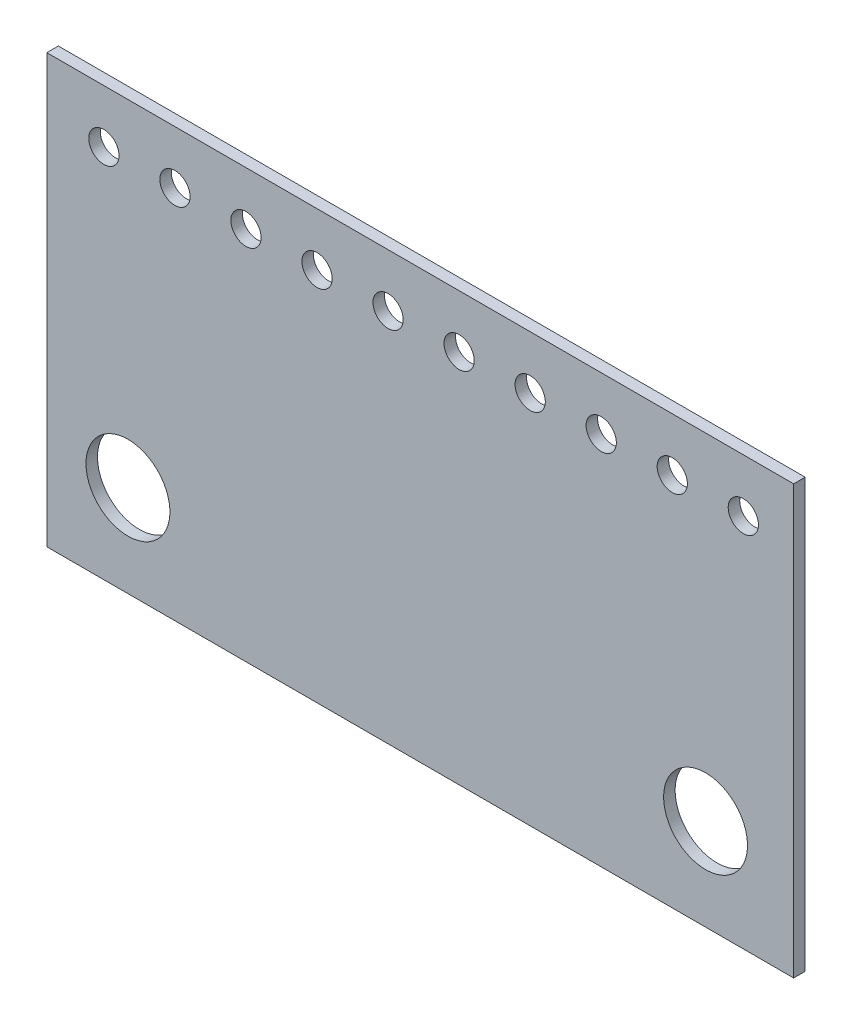
ISO-10303-21;
HEADER;
FILE_DESCRIPTION(('STEP AP214'),'2;1');
FILE_NAME('part.step','',(''),(''),'','','');
FILE_SCHEMA(('AUTOMOTIVE_DESIGN { 1 0 10303 214 1 1 1 1 }'));
ENDSEC;
DATA;
#1=APPLICATION_CONTEXT('core data for automotive mechanical design processes');
#2=APPLICATION_PROTOCOL_DEFINITION('international standard','automotive_design',2000,#1);
#3=PRODUCT_CONTEXT('',#1,'mechanical');
#4=PRODUCT('Part','Part','',(#3));
#5=PRODUCT_RELATED_PRODUCT_CATEGORY('part','',(#4));
#6=PRODUCT_DEFINITION_FORMATION('','',#4);
#7=PRODUCT_DEFINITION_CONTEXT('part definition',#1,'design');
#8=PRODUCT_DEFINITION('design','',#6,#7);
#9=PRODUCT_DEFINITION_SHAPE('','',#8);
#10=(LENGTH_UNIT() NAMED_UNIT(*) SI_UNIT(.MILLI.,.METRE.));
#11=(NAMED_UNIT(*) PLANE_ANGLE_UNIT() SI_UNIT($,.RADIAN.));
#12=(NAMED_UNIT(*) SI_UNIT($,.STERADIAN.) SOLID_ANGLE_UNIT());
#13=UNCERTAINTY_MEASURE_WITH_UNIT(LENGTH_MEASURE(1.E-05),#10,'distance_accuracy_value','');
#14=(GEOMETRIC_REPRESENTATION_CONTEXT(3) GLOBAL_UNCERTAINTY_ASSIGNED_CONTEXT((#13)) GLOBAL_UNIT_ASSIGNED_CONTEXT((#10,
#11,#12)) REPRESENTATION_CONTEXT('',''));
#15=CARTESIAN_POINT('',(0.,0.,0.));
#16=DIRECTION('',(0.,0.,1.));
#17=DIRECTION('',(1.,0.,0.));
#18=AXIS2_PLACEMENT_3D('',#15,#16,#17);
#19=CARTESIAN_POINT('',(0.,0.,0.41148));
#20=DIRECTION('',(0.,0.,1.));
#21=DIRECTION('',(1.,0.,0.));
#22=AXIS2_PLACEMENT_3D('',#19,#20,#21);
#23=PLANE('',#22);
#24=CARTESIAN_POINT('',(42.68003,38.80002,0.411480000000006));
#25=DIRECTION('',(0.,0.,-1.));
#26=DIRECTION('',(-1.,0.,0.));
#27=AXIS2_PLACEMENT_3D('',#24,#25,#26);
#28=CIRCLE('',#27,0.540499999999985);
#29=CARTESIAN_POINT('',(42.13953,38.80002,0.411480000000006));
#30=VERTEX_POINT('',#29);
#31=EDGE_CURVE('E144',#30,#30,#28,.T.);
#32=ORIENTED_EDGE('',*,*,#31,.T.);
#33=EDGE_LOOP('',(#32));
#34=FACE_BOUND('',#33,.T.);
#35=CARTESIAN_POINT('',(45.22003,38.80002,0.411480000000006));
#36=DIRECTION('',(0.,0.,-1.));
#37=DIRECTION('',(-1.,0.,0.));
#38=AXIS2_PLACEMENT_3D('',#35,#36,#37);
#39=CIRCLE('',#38,0.540499999999985);
#40=CARTESIAN_POINT('',(44.67953,38.80002,0.411480000000006));
#41=VERTEX_POINT('',#40);
#42=EDGE_CURVE('E138',#41,#41,#39,.T.);
#43=ORIENTED_EDGE('',*,*,#42,.T.);
#44=EDGE_LOOP('',(#43));
#45=FACE_BOUND('',#44,.T.);
#46=CARTESIAN_POINT('',(50.30003,38.80002,0.411480000000006));
#47=DIRECTION('',(0.,0.,-1.));
#48=DIRECTION('',(-1.,0.,0.));
#49=AXIS2_PLACEMENT_3D('',#46,#47,#48);
#50=CIRCLE('',#49,0.540499999999985);
#51=CARTESIAN_POINT('',(49.75953,38.80002,0.411480000000006));
#52=VERTEX_POINT('',#51);
#53=EDGE_CURVE('E135',#52,#52,#50,.T.);
#54=ORIENTED_EDGE('',*,*,#53,.T.);
#55=EDGE_LOOP('',(#54));
#56=FACE_BOUND('',#55,.T.);
#57=CARTESIAN_POINT('',(47.76003,38.80002,0.411480000000006));
#58=DIRECTION('',(0.,0.,-1.));
#59=DIRECTION('',(-1.,0.,0.));
#60=AXIS2_PLACEMENT_3D('',#57,#58,#59);
#61=CIRCLE('',#60,0.540499999999985);
#62=CARTESIAN_POINT('',(47.21953,38.80002,0.411480000000006));
#63=VERTEX_POINT('',#62);
#64=EDGE_CURVE('E130',#63,#63,#61,.T.);
#65=ORIENTED_EDGE('',*,*,#64,.T.);
#66=EDGE_LOOP('',(#65));
#67=FACE_BOUND('',#66,.T.);
#68=CARTESIAN_POINT('',(37.60003,38.80002,0.411480000000006));
#69=DIRECTION('',(0.,0.,-1.));
#70=DIRECTION('',(-1.,0.,0.));
#71=AXIS2_PLACEMENT_3D('',#68,#69,#70);
#72=CIRCLE('',#71,0.540499999999985);
#73=CARTESIAN_POINT('',(37.05953,38.80002,0.411480000000006));
#74=VERTEX_POINT('',#73);
#75=EDGE_CURVE('E109',#74,#74,#72,.T.);
#76=ORIENTED_EDGE('',*,*,#75,.T.);
#77=EDGE_LOOP('',(#76));
#78=FACE_BOUND('',#77,.T.);
#79=DIRECTION('',(0.,-1.,0.));
#80=VECTOR('',#79,1.);
#81=CARTESIAN_POINT('',(25.4,40.7,0.41148));
#82=LINE('',#81,#80);
#83=CARTESIAN_POINT('',(25.4,40.7,0.41148));
#84=VERTEX_POINT('',#83);
#85=CARTESIAN_POINT('',(25.4,25.4,0.41148));
#86=VERTEX_POINT('',#85);
#87=EDGE_CURVE('E92',#84,#86,#82,.T.);
#88=ORIENTED_EDGE('',*,*,#87,.T.);
#89=DIRECTION('',(1.,0.,0.));
#90=VECTOR('',#89,1.);
#91=CARTESIAN_POINT('',(25.4,25.4,0.41148));
#92=LINE('',#91,#90);
#93=CARTESIAN_POINT('',(52.1,25.4,0.41148));
#94=VERTEX_POINT('',#93);
#95=EDGE_CURVE('E89',#86,#94,#92,.T.);
#96=ORIENTED_EDGE('',*,*,#95,.T.);
#97=DIRECTION('',(0.,1.,0.));
#98=VECTOR('',#97,1.);
#99=CARTESIAN_POINT('',(52.1,25.4,0.41148));
#100=LINE('',#99,#98);
#101=CARTESIAN_POINT('',(52.1,40.7,0.41148));
#102=VERTEX_POINT('',#101);
#103=EDGE_CURVE('E91',#94,#102,#100,.T.);
#104=ORIENTED_EDGE('',*,*,#103,.T.);
#105=DIRECTION('',(-1.,0.,0.));
#106=VECTOR('',#105,1.);
#107=CARTESIAN_POINT('',(52.1,40.7,0.41148));
#108=LINE('',#107,#106);
#109=EDGE_CURVE('E58',#102,#84,#108,.T.);
#110=ORIENTED_EDGE('',*,*,#109,.T.);
#111=EDGE_LOOP('',(#88,#96,#104,#110));
#112=FACE_BOUND('',#111,.T.);
#113=CARTESIAN_POINT('',(40.14003,38.80002,0.411480000000006));
#114=DIRECTION('',(0.,0.,-1.));
#115=DIRECTION('',(-1.,0.,0.));
#116=AXIS2_PLACEMENT_3D('',#113,#114,#115);
#117=CIRCLE('',#116,0.540499999999985);
#118=CARTESIAN_POINT('',(39.59953,38.80002,0.411480000000006));
#119=VERTEX_POINT('',#118);
#120=EDGE_CURVE('E151',#119,#119,#117,.T.);
#121=ORIENTED_EDGE('',*,*,#120,.T.);
#122=EDGE_LOOP('',(#121));
#123=FACE_BOUND('',#122,.T.);
#124=CARTESIAN_POINT('',(35.06003,38.80002,0.411480000000006));
#125=DIRECTION('',(0.,0.,-1.));
#126=DIRECTION('',(-1.,0.,0.));
#127=AXIS2_PLACEMENT_3D('',#124,#125,#126);
#128=CIRCLE('',#127,0.540499999999985);
#129=CARTESIAN_POINT('',(34.51953,38.80002,0.411480000000006));
#130=VERTEX_POINT('',#129);
#131=EDGE_CURVE('E160',#130,#130,#128,.T.);
#132=ORIENTED_EDGE('',*,*,#131,.T.);
#133=EDGE_LOOP('',(#132));
#134=FACE_BOUND('',#133,.T.);
#135=CARTESIAN_POINT('',(32.52003,38.80002,0.411480000000006));
#136=DIRECTION('',(0.,0.,-1.));
#137=DIRECTION('',(-1.,0.,0.));
#138=AXIS2_PLACEMENT_3D('',#135,#136,#137);
#139=CIRCLE('',#138,0.540499999999985);
#140=CARTESIAN_POINT('',(31.97953,38.80002,0.411480000000006));
#141=VERTEX_POINT('',#140);
#142=EDGE_CURVE('E162',#141,#141,#139,.T.);
#143=ORIENTED_EDGE('',*,*,#142,.T.);
#144=EDGE_LOOP('',(#143));
#145=FACE_BOUND('',#144,.T.);
#146=CARTESIAN_POINT('',(29.98003,38.80002,0.411480000000006));
#147=DIRECTION('',(0.,0.,-1.));
#148=DIRECTION('',(-1.,0.,0.));
#149=AXIS2_PLACEMENT_3D('',#146,#147,#148);
#150=CIRCLE('',#149,0.540499999999989);
#151=CARTESIAN_POINT('',(29.43953,38.80002,0.411480000000006));
#152=VERTEX_POINT('',#151);
#153=EDGE_CURVE('E166',#152,#152,#150,.T.);
#154=ORIENTED_EDGE('',*,*,#153,.T.);
#155=EDGE_LOOP('',(#154));
#156=FACE_BOUND('',#155,.T.);
#157=CARTESIAN_POINT('',(27.44003,38.80002,0.411480000000006));
#158=DIRECTION('',(0.,0.,-1.));
#159=DIRECTION('',(-1.,0.,0.));
#160=AXIS2_PLACEMENT_3D('',#157,#158,#159);
#161=CIRCLE('',#160,0.540499999999989);
#162=CARTESIAN_POINT('',(26.89953,38.80002,0.411480000000006));
#163=VERTEX_POINT('',#162);
#164=EDGE_CURVE('E172',#163,#163,#161,.T.);
#165=ORIENTED_EDGE('',*,*,#164,.T.);
#166=EDGE_LOOP('',(#165));
#167=FACE_BOUND('',#166,.T.);
#168=CARTESIAN_POINT('',(48.95002,28.68,0.411480000000006));
#169=DIRECTION('',(0.,0.,-1.));
#170=DIRECTION('',(-1.,0.,0.));
#171=AXIS2_PLACEMENT_3D('',#168,#169,#170);
#172=CIRCLE('',#171,1.49999999999999);
#173=CARTESIAN_POINT('',(47.45002,28.68,0.411480000000006));
#174=VERTEX_POINT('',#173);
#175=EDGE_CURVE('E182',#174,#174,#172,.T.);
#176=ORIENTED_EDGE('',*,*,#175,.T.);
#177=EDGE_LOOP('',(#176));
#178=FACE_BOUND('',#177,.T.);
#179=CARTESIAN_POINT('',(28.30002,28.68,0.411480000000006));
#180=DIRECTION('',(0.,0.,-1.));
#181=DIRECTION('',(-1.,0.,0.));
#182=AXIS2_PLACEMENT_3D('',#179,#180,#181);
#183=CIRCLE('',#182,1.49999999999999);
#184=CARTESIAN_POINT('',(26.80002,28.68,0.411480000000006));
#185=VERTEX_POINT('',#184);
#186=EDGE_CURVE('E186',#185,#185,#183,.T.);
#187=ORIENTED_EDGE('',*,*,#186,.T.);
#188=EDGE_LOOP('',(#187));
#189=FACE_BOUND('',#188,.T.);
#190=ADVANCED_FACE('F43',(#34,#45,#56,#67,#78,#112,#123,#134,#145,#156,#167,#178,#189),#23,.T.);
#191=CARTESIAN_POINT('',(0.,0.,0.));
#192=DIRECTION('',(0.,0.,1.));
#193=DIRECTION('',(1.,0.,0.));
#194=AXIS2_PLACEMENT_3D('',#191,#192,#193);
#195=PLANE('',#194);
#196=CARTESIAN_POINT('',(28.30002,28.68,0.));
#197=DIRECTION('',(0.,0.,-1.));
#198=DIRECTION('',(-1.,0.,0.));
#199=AXIS2_PLACEMENT_3D('',#196,#197,#198);
#200=CIRCLE('',#199,1.49999999999999);
#201=CARTESIAN_POINT('',(26.80002,28.68,0.));
#202=VERTEX_POINT('',#201);
#203=EDGE_CURVE('E187',#202,#202,#200,.T.);
#204=ORIENTED_EDGE('',*,*,#203,.F.);
#205=EDGE_LOOP('',(#204));
#206=FACE_BOUND('',#205,.T.);
#207=CARTESIAN_POINT('',(48.95002,28.68,0.));
#208=DIRECTION('',(0.,0.,-1.));
#209=DIRECTION('',(-1.,0.,0.));
#210=AXIS2_PLACEMENT_3D('',#207,#208,#209);
#211=CIRCLE('',#210,1.49999999999999);
#212=CARTESIAN_POINT('',(47.45002,28.68,0.));
#213=VERTEX_POINT('',#212);
#214=EDGE_CURVE('E184',#213,#213,#211,.T.);
#215=ORIENTED_EDGE('',*,*,#214,.F.);
#216=EDGE_LOOP('',(#215));
#217=FACE_BOUND('',#216,.T.);
#218=CARTESIAN_POINT('',(29.98003,38.80002,0.));
#219=DIRECTION('',(0.,0.,-1.));
#220=DIRECTION('',(-1.,0.,0.));
#221=AXIS2_PLACEMENT_3D('',#218,#219,#220);
#222=CIRCLE('',#221,0.540499999999989);
#223=CARTESIAN_POINT('',(29.43953,38.80002,0.));
#224=VERTEX_POINT('',#223);
#225=EDGE_CURVE('E171',#224,#224,#222,.T.);
#226=ORIENTED_EDGE('',*,*,#225,.F.);
#227=EDGE_LOOP('',(#226));
#228=FACE_BOUND('',#227,.T.);
#229=CARTESIAN_POINT('',(40.14003,38.80002,0.));
#230=DIRECTION('',(0.,0.,-1.));
#231=DIRECTION('',(-1.,0.,0.));
#232=AXIS2_PLACEMENT_3D('',#229,#230,#231);
#233=CIRCLE('',#232,0.540499999999985);
#234=CARTESIAN_POINT('',(39.59953,38.80002,0.));
#235=VERTEX_POINT('',#234);
#236=EDGE_CURVE('E152',#235,#235,#233,.T.);
#237=ORIENTED_EDGE('',*,*,#236,.F.);
#238=EDGE_LOOP('',(#237));
#239=FACE_BOUND('',#238,.T.);
#240=CARTESIAN_POINT('',(42.68003,38.80002,0.));
#241=DIRECTION('',(0.,0.,-1.));
#242=DIRECTION('',(-1.,0.,0.));
#243=AXIS2_PLACEMENT_3D('',#240,#241,#242);
#244=CIRCLE('',#243,0.540499999999985);
#245=CARTESIAN_POINT('',(42.13953,38.80002,0.));
#246=VERTEX_POINT('',#245);
#247=EDGE_CURVE('E146',#246,#246,#244,.T.);
#248=ORIENTED_EDGE('',*,*,#247,.F.);
#249=EDGE_LOOP('',(#248));
#250=FACE_BOUND('',#249,.T.);
#251=CARTESIAN_POINT('',(45.22003,38.80002,0.));
#252=DIRECTION('',(0.,0.,-1.));
#253=DIRECTION('',(-1.,0.,0.));
#254=AXIS2_PLACEMENT_3D('',#251,#252,#253);
#255=CIRCLE('',#254,0.540499999999985);
#256=CARTESIAN_POINT('',(44.67953,38.80002,0.));
#257=VERTEX_POINT('',#256);
#258=EDGE_CURVE('E142',#257,#257,#255,.T.);
#259=ORIENTED_EDGE('',*,*,#258,.F.);
#260=EDGE_LOOP('',(#259));
#261=FACE_BOUND('',#260,.T.);
#262=CARTESIAN_POINT('',(50.30003,38.80002,0.));
#263=DIRECTION('',(0.,0.,-1.));
#264=DIRECTION('',(-1.,0.,0.));
#265=AXIS2_PLACEMENT_3D('',#262,#263,#264);
#266=CIRCLE('',#265,0.540499999999985);
#267=CARTESIAN_POINT('',(49.75953,38.80002,0.));
#268=VERTEX_POINT('',#267);
#269=EDGE_CURVE('E136',#268,#268,#266,.T.);
#270=ORIENTED_EDGE('',*,*,#269,.F.);
#271=EDGE_LOOP('',(#270));
#272=FACE_BOUND('',#271,.T.);
#273=CARTESIAN_POINT('',(37.60003,38.80002,0.));
#274=DIRECTION('',(0.,0.,-1.));
#275=DIRECTION('',(-1.,0.,0.));
#276=AXIS2_PLACEMENT_3D('',#273,#274,#275);
#277=CIRCLE('',#276,0.540499999999985);
#278=CARTESIAN_POINT('',(37.05953,38.80002,0.));
#279=VERTEX_POINT('',#278);
#280=EDGE_CURVE('E123',#279,#279,#277,.T.);
#281=ORIENTED_EDGE('',*,*,#280,.F.);
#282=EDGE_LOOP('',(#281));
#283=FACE_BOUND('',#282,.T.);
#284=DIRECTION('',(0.,-1.,0.));
#285=VECTOR('',#284,1.);
#286=CARTESIAN_POINT('',(25.4,40.7,0.));
#287=LINE('',#286,#285);
#288=CARTESIAN_POINT('',(25.4,40.7,0.));
#289=VERTEX_POINT('',#288);
#290=CARTESIAN_POINT('',(25.4,25.4,0.));
#291=VERTEX_POINT('',#290);
#292=EDGE_CURVE('E110',#289,#291,#287,.T.);
#293=ORIENTED_EDGE('',*,*,#292,.F.);
#294=DIRECTION('',(-1.,0.,0.));
#295=VECTOR('',#294,1.);
#296=CARTESIAN_POINT('',(52.1,40.7,0.));
#297=LINE('',#296,#295);
#298=CARTESIAN_POINT('',(52.1,40.7,0.));
#299=VERTEX_POINT('',#298);
#300=EDGE_CURVE('E82',#299,#289,#297,.T.);
#301=ORIENTED_EDGE('',*,*,#300,.F.);
#302=DIRECTION('',(0.,1.,0.));
#303=VECTOR('',#302,1.);
#304=CARTESIAN_POINT('',(52.1,25.4,0.));
#305=LINE('',#304,#303);
#306=CARTESIAN_POINT('',(52.1,25.4,0.));
#307=VERTEX_POINT('',#306);
#308=EDGE_CURVE('E76',#307,#299,#305,.T.);
#309=ORIENTED_EDGE('',*,*,#308,.F.);
#310=DIRECTION('',(1.,0.,0.));
#311=VECTOR('',#310,1.);
#312=CARTESIAN_POINT('',(25.4,25.4,0.));
#313=LINE('',#312,#311);
#314=EDGE_CURVE('E97',#291,#307,#313,.T.);
#315=ORIENTED_EDGE('',*,*,#314,.F.);
#316=EDGE_LOOP('',(#293,#301,#309,#315));
#317=FACE_BOUND('',#316,.T.);
#318=CARTESIAN_POINT('',(47.76003,38.80002,0.));
#319=DIRECTION('',(0.,0.,-1.));
#320=DIRECTION('',(-1.,0.,0.));
#321=AXIS2_PLACEMENT_3D('',#318,#319,#320);
#322=CIRCLE('',#321,0.540499999999985);
#323=CARTESIAN_POINT('',(47.21953,38.80002,0.));
#324=VERTEX_POINT('',#323);
#325=EDGE_CURVE('E128',#324,#324,#322,.T.);
#326=ORIENTED_EDGE('',*,*,#325,.F.);
#327=EDGE_LOOP('',(#326));
#328=FACE_BOUND('',#327,.T.);
#329=CARTESIAN_POINT('',(35.06003,38.80002,0.));
#330=DIRECTION('',(0.,0.,-1.));
#331=DIRECTION('',(-1.,0.,0.));
#332=AXIS2_PLACEMENT_3D('',#329,#330,#331);
#333=CIRCLE('',#332,0.540499999999985);
#334=CARTESIAN_POINT('',(34.51953,38.80002,0.));
#335=VERTEX_POINT('',#334);
#336=EDGE_CURVE('E159',#335,#335,#333,.T.);
#337=ORIENTED_EDGE('',*,*,#336,.F.);
#338=EDGE_LOOP('',(#337));
#339=FACE_BOUND('',#338,.T.);
#340=CARTESIAN_POINT('',(32.52003,38.80002,0.));
#341=DIRECTION('',(0.,0.,-1.));
#342=DIRECTION('',(-1.,0.,0.));
#343=AXIS2_PLACEMENT_3D('',#340,#341,#342);
#344=CIRCLE('',#343,0.540499999999985);
#345=CARTESIAN_POINT('',(31.97953,38.80002,0.));
#346=VERTEX_POINT('',#345);
#347=EDGE_CURVE('E167',#346,#346,#344,.T.);
#348=ORIENTED_EDGE('',*,*,#347,.F.);
#349=EDGE_LOOP('',(#348));
#350=FACE_BOUND('',#349,.T.);
#351=CARTESIAN_POINT('',(27.44003,38.80002,0.));
#352=DIRECTION('',(0.,0.,-1.));
#353=DIRECTION('',(-1.,0.,0.));
#354=AXIS2_PLACEMENT_3D('',#351,#352,#353);
#355=CIRCLE('',#354,0.540499999999989);
#356=CARTESIAN_POINT('',(26.89953,38.80002,0.));
#357=VERTEX_POINT('',#356);
#358=EDGE_CURVE('E177',#357,#357,#355,.T.);
#359=ORIENTED_EDGE('',*,*,#358,.F.);
#360=EDGE_LOOP('',(#359));
#361=FACE_BOUND('',#360,.T.);
#362=ADVANCED_FACE('F120',(#206,#217,#228,#239,#250,#261,#272,#283,#317,#328,#339,#350,#361),
#195,.F.);
#363=CARTESIAN_POINT('',(25.4,40.7,0.41148));
#364=DIRECTION('',(1.,0.,0.));
#365=DIRECTION('',(0.,0.,-1.));
#366=AXIS2_PLACEMENT_3D('',#363,#364,#365);
#367=PLANE('',#366);
#368=ORIENTED_EDGE('',*,*,#292,.T.);
#369=DIRECTION('',(0.,0.,-1.));
#370=VECTOR('',#369,1.);
#371=CARTESIAN_POINT('',(25.4,25.4,0.41148));
#372=LINE('',#371,#370);
#373=EDGE_CURVE('E11',#86,#291,#372,.T.);
#374=ORIENTED_EDGE('',*,*,#373,.F.);
#375=ORIENTED_EDGE('',*,*,#87,.F.);
#376=DIRECTION('',(0.,0.,-1.));
#377=VECTOR('',#376,1.);
#378=CARTESIAN_POINT('',(25.4,40.7,0.41148));
#379=LINE('',#378,#377);
#380=EDGE_CURVE('E103',#84,#289,#379,.T.);
#381=ORIENTED_EDGE('',*,*,#380,.T.);
#382=EDGE_LOOP('',(#368,#374,#375,#381));
#383=FACE_BOUND('',#382,.T.);
#384=ADVANCED_FACE('F44',(#383),#367,.F.);
#385=CARTESIAN_POINT('',(25.4,25.4,0.41148));
#386=DIRECTION('',(0.,1.,0.));
#387=DIRECTION('',(0.,0.,1.));
#388=AXIS2_PLACEMENT_3D('',#385,#386,#387);
#389=PLANE('',#388);
#390=ORIENTED_EDGE('',*,*,#314,.T.);
#391=DIRECTION('',(0.,0.,-1.));
#392=VECTOR('',#391,1.);
#393=CARTESIAN_POINT('',(52.1,25.4,0.41148));
#394=LINE('',#393,#392);
#395=EDGE_CURVE('E55',#94,#307,#394,.T.);
#396=ORIENTED_EDGE('',*,*,#395,.F.);
#397=ORIENTED_EDGE('',*,*,#95,.F.);
#398=ORIENTED_EDGE('',*,*,#373,.T.);
#399=EDGE_LOOP('',(#390,#396,#397,#398));
#400=FACE_BOUND('',#399,.T.);
#401=ADVANCED_FACE('F98',(#400),#389,.F.);
#402=CARTESIAN_POINT('',(52.1,25.4,0.41148));
#403=DIRECTION('',(-1.,0.,0.));
#404=DIRECTION('',(0.,0.,1.));
#405=AXIS2_PLACEMENT_3D('',#402,#403,#404);
#406=PLANE('',#405);
#407=ORIENTED_EDGE('',*,*,#308,.T.);
#408=DIRECTION('',(0.,0.,-1.));
#409=VECTOR('',#408,1.);
#410=CARTESIAN_POINT('',(52.1,40.7,0.41148));
#411=LINE('',#410,#409);
#412=EDGE_CURVE('E99',#102,#299,#411,.T.);
#413=ORIENTED_EDGE('',*,*,#412,.F.);
#414=ORIENTED_EDGE('',*,*,#103,.F.);
#415=ORIENTED_EDGE('',*,*,#395,.T.);
#416=EDGE_LOOP('',(#407,#413,#414,#415));
#417=FACE_BOUND('',#416,.T.);
#418=ADVANCED_FACE('F101',(#417),#406,.F.);
#419=CARTESIAN_POINT('',(52.1,40.7,0.41148));
#420=DIRECTION('',(0.,-1.,0.));
#421=DIRECTION('',(0.,0.,-1.));
#422=AXIS2_PLACEMENT_3D('',#419,#420,#421);
#423=PLANE('',#422);
#424=ORIENTED_EDGE('',*,*,#300,.T.);
#425=ORIENTED_EDGE('',*,*,#380,.F.);
#426=ORIENTED_EDGE('',*,*,#109,.F.);
#427=ORIENTED_EDGE('',*,*,#412,.T.);
#428=EDGE_LOOP('',(#424,#425,#426,#427));
#429=FACE_BOUND('',#428,.T.);
#430=ADVANCED_FACE('F113',(#429),#423,.F.);
#431=CARTESIAN_POINT('',(37.60003,38.80002,0.));
#432=DIRECTION('',(0.,0.,-1.));
#433=DIRECTION('',(-1.,0.,0.));
#434=AXIS2_PLACEMENT_3D('',#431,#432,#433);
#435=CYLINDRICAL_SURFACE('',#434,0.540499999999985);
#436=ORIENTED_EDGE('',*,*,#75,.F.);
#437=EDGE_LOOP('',(#436));
#438=FACE_BOUND('',#437,.T.);
#439=ORIENTED_EDGE('',*,*,#280,.T.);
#440=EDGE_LOOP('',(#439));
#441=FACE_BOUND('',#440,.T.);
#442=ADVANCED_FACE('F213',(#438,#441),#435,.F.);
#443=CARTESIAN_POINT('',(47.76003,38.80002,0.));
#444=DIRECTION('',(0.,0.,-1.));
#445=DIRECTION('',(-1.,0.,0.));
#446=AXIS2_PLACEMENT_3D('',#443,#444,#445);
#447=CYLINDRICAL_SURFACE('',#446,0.540499999999985);
#448=ORIENTED_EDGE('',*,*,#64,.F.);
#449=EDGE_LOOP('',(#448));
#450=FACE_BOUND('',#449,.T.);
#451=ORIENTED_EDGE('',*,*,#325,.T.);
#452=EDGE_LOOP('',(#451));
#453=FACE_BOUND('',#452,.T.);
#454=ADVANCED_FACE('F214',(#450,#453),#447,.F.);
#455=CARTESIAN_POINT('',(50.30003,38.80002,0.));
#456=DIRECTION('',(0.,0.,-1.));
#457=DIRECTION('',(-1.,0.,0.));
#458=AXIS2_PLACEMENT_3D('',#455,#456,#457);
#459=CYLINDRICAL_SURFACE('',#458,0.540499999999985);
#460=ORIENTED_EDGE('',*,*,#53,.F.);
#461=EDGE_LOOP('',(#460));
#462=FACE_BOUND('',#461,.T.);
#463=ORIENTED_EDGE('',*,*,#269,.T.);
#464=EDGE_LOOP('',(#463));
#465=FACE_BOUND('',#464,.T.);
#466=ADVANCED_FACE('F225',(#462,#465),#459,.F.);
#467=CARTESIAN_POINT('',(45.22003,38.80002,0.));
#468=DIRECTION('',(0.,0.,-1.));
#469=DIRECTION('',(-1.,0.,0.));
#470=AXIS2_PLACEMENT_3D('',#467,#468,#469);
#471=CYLINDRICAL_SURFACE('',#470,0.540499999999985);
#472=ORIENTED_EDGE('',*,*,#42,.F.);
#473=EDGE_LOOP('',(#472));
#474=FACE_BOUND('',#473,.T.);
#475=ORIENTED_EDGE('',*,*,#258,.T.);
#476=EDGE_LOOP('',(#475));
#477=FACE_BOUND('',#476,.T.);
#478=ADVANCED_FACE('F282',(#474,#477),#471,.F.);
#479=CARTESIAN_POINT('',(42.68003,38.80002,0.));
#480=DIRECTION('',(0.,0.,-1.));
#481=DIRECTION('',(-1.,0.,0.));
#482=AXIS2_PLACEMENT_3D('',#479,#480,#481);
#483=CYLINDRICAL_SURFACE('',#482,0.540499999999985);
#484=ORIENTED_EDGE('',*,*,#31,.F.);
#485=EDGE_LOOP('',(#484));
#486=FACE_BOUND('',#485,.T.);
#487=ORIENTED_EDGE('',*,*,#247,.T.);
#488=EDGE_LOOP('',(#487));
#489=FACE_BOUND('',#488,.T.);
#490=ADVANCED_FACE('F293',(#486,#489),#483,.F.);
#491=CARTESIAN_POINT('',(40.14003,38.80002,0.));
#492=DIRECTION('',(0.,0.,-1.));
#493=DIRECTION('',(-1.,0.,0.));
#494=AXIS2_PLACEMENT_3D('',#491,#492,#493);
#495=CYLINDRICAL_SURFACE('',#494,0.540499999999985);
#496=ORIENTED_EDGE('',*,*,#120,.F.);
#497=EDGE_LOOP('',(#496));
#498=FACE_BOUND('',#497,.T.);
#499=ORIENTED_EDGE('',*,*,#236,.T.);
#500=EDGE_LOOP('',(#499));
#501=FACE_BOUND('',#500,.T.);
#502=ADVANCED_FACE('F304',(#498,#501),#495,.F.);
#503=CARTESIAN_POINT('',(35.06003,38.80002,0.));
#504=DIRECTION('',(0.,0.,-1.));
#505=DIRECTION('',(-1.,0.,0.));
#506=AXIS2_PLACEMENT_3D('',#503,#504,#505);
#507=CYLINDRICAL_SURFACE('',#506,0.540499999999985);
#508=ORIENTED_EDGE('',*,*,#131,.F.);
#509=EDGE_LOOP('',(#508));
#510=FACE_BOUND('',#509,.T.);
#511=ORIENTED_EDGE('',*,*,#336,.T.);
#512=EDGE_LOOP('',(#511));
#513=FACE_BOUND('',#512,.T.);
#514=ADVANCED_FACE('F312',(#510,#513),#507,.F.);
#515=CARTESIAN_POINT('',(32.52003,38.80002,0.));
#516=DIRECTION('',(0.,0.,-1.));
#517=DIRECTION('',(-1.,0.,0.));
#518=AXIS2_PLACEMENT_3D('',#515,#516,#517);
#519=CYLINDRICAL_SURFACE('',#518,0.540499999999985);
#520=ORIENTED_EDGE('',*,*,#142,.F.);
#521=EDGE_LOOP('',(#520));
#522=FACE_BOUND('',#521,.T.);
#523=ORIENTED_EDGE('',*,*,#347,.T.);
#524=EDGE_LOOP('',(#523));
#525=FACE_BOUND('',#524,.T.);
#526=ADVANCED_FACE('F324',(#522,#525),#519,.F.);
#527=CARTESIAN_POINT('',(29.98003,38.80002,0.));
#528=DIRECTION('',(0.,0.,-1.));
#529=DIRECTION('',(-1.,0.,0.));
#530=AXIS2_PLACEMENT_3D('',#527,#528,#529);
#531=CYLINDRICAL_SURFACE('',#530,0.540499999999989);
#532=ORIENTED_EDGE('',*,*,#153,.F.);
#533=EDGE_LOOP('',(#532));
#534=FACE_BOUND('',#533,.T.);
#535=ORIENTED_EDGE('',*,*,#225,.T.);
#536=EDGE_LOOP('',(#535));
#537=FACE_BOUND('',#536,.T.);
#538=ADVANCED_FACE('F333',(#534,#537),#531,.F.);
#539=CARTESIAN_POINT('',(27.44003,38.80002,0.));
#540=DIRECTION('',(0.,0.,-1.));
#541=DIRECTION('',(-1.,0.,0.));
#542=AXIS2_PLACEMENT_3D('',#539,#540,#541);
#543=CYLINDRICAL_SURFACE('',#542,0.540499999999989);
#544=ORIENTED_EDGE('',*,*,#164,.F.);
#545=EDGE_LOOP('',(#544));
#546=FACE_BOUND('',#545,.T.);
#547=ORIENTED_EDGE('',*,*,#358,.T.);
#548=EDGE_LOOP('',(#547));
#549=FACE_BOUND('',#548,.T.);
#550=ADVANCED_FACE('F344',(#546,#549),#543,.F.);
#551=CARTESIAN_POINT('',(48.95002,28.68,0.));
#552=DIRECTION('',(0.,0.,-1.));
#553=DIRECTION('',(-1.,0.,0.));
#554=AXIS2_PLACEMENT_3D('',#551,#552,#553);
#555=CYLINDRICAL_SURFACE('',#554,1.49999999999999);
#556=ORIENTED_EDGE('',*,*,#175,.F.);
#557=EDGE_LOOP('',(#556));
#558=FACE_BOUND('',#557,.T.);
#559=ORIENTED_EDGE('',*,*,#214,.T.);
#560=EDGE_LOOP('',(#559));
#561=FACE_BOUND('',#560,.T.);
#562=ADVANCED_FACE('F352',(#558,#561),#555,.F.);
#563=CARTESIAN_POINT('',(28.30002,28.68,0.));
#564=DIRECTION('',(0.,0.,-1.));
#565=DIRECTION('',(-1.,0.,0.));
#566=AXIS2_PLACEMENT_3D('',#563,#564,#565);
#567=CYLINDRICAL_SURFACE('',#566,1.49999999999999);
#568=ORIENTED_EDGE('',*,*,#186,.F.);
#569=EDGE_LOOP('',(#568));
#570=FACE_BOUND('',#569,.T.);
#571=ORIENTED_EDGE('',*,*,#203,.T.);
#572=EDGE_LOOP('',(#571));
#573=FACE_BOUND('',#572,.T.);
#574=ADVANCED_FACE('F193',(#570,#573),#567,.F.);
#575=CLOSED_SHELL('',(#190,#362,#384,#401,#418,#430,#442,#454,#466,#478,#490,#502,#514,#526,
#538,#550,#562,#574));
#576=MANIFOLD_SOLID_BREP('B2',#575);
#577=ADVANCED_BREP_SHAPE_REPRESENTATION('',(#18,#576),#14);
#578=SHAPE_DEFINITION_REPRESENTATION(#9,#577);
ENDSEC;
END-ISO-10303-21;
